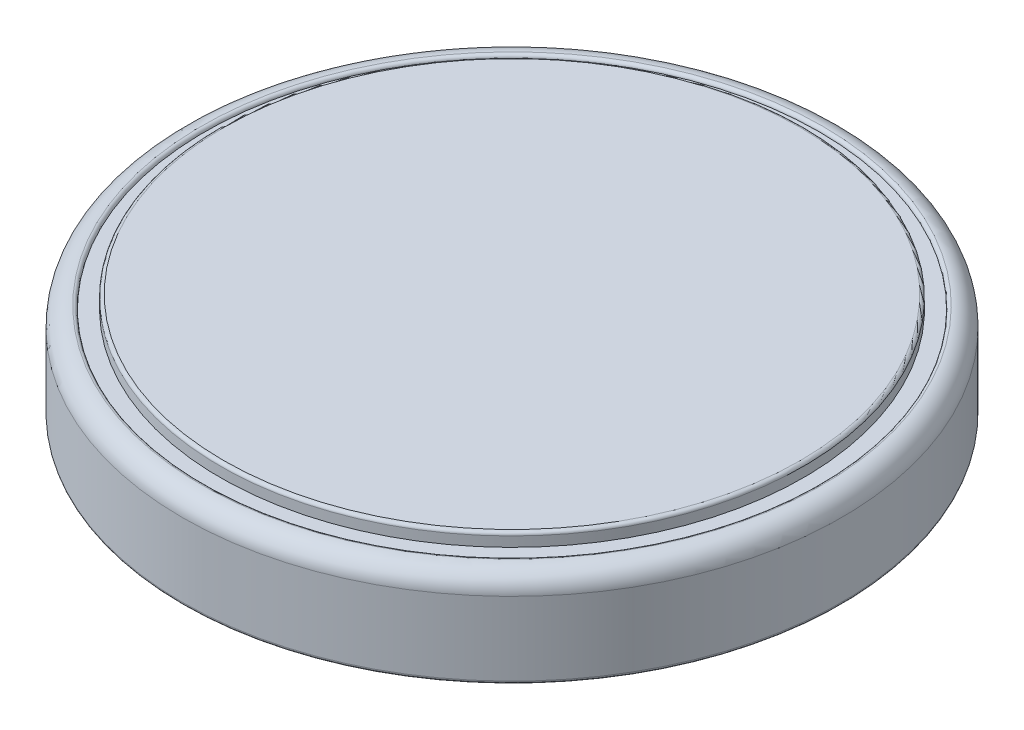
ISO-10303-21;
HEADER;
FILE_DESCRIPTION(('STEP AP214'),'2;1');
FILE_NAME('part.step','',(''),(''),'','','');
FILE_SCHEMA(('AUTOMOTIVE_DESIGN { 1 0 10303 214 1 1 1 1 }'));
ENDSEC;
DATA;
#1=APPLICATION_CONTEXT('core data for automotive mechanical design processes');
#2=APPLICATION_PROTOCOL_DEFINITION('international standard','automotive_design',2000,#1);
#3=PRODUCT_CONTEXT('',#1,'mechanical');
#4=PRODUCT('Part','Part','',(#3));
#5=PRODUCT_RELATED_PRODUCT_CATEGORY('part','',(#4));
#6=PRODUCT_DEFINITION_FORMATION('','',#4);
#7=PRODUCT_DEFINITION_CONTEXT('part definition',#1,'design');
#8=PRODUCT_DEFINITION('design','',#6,#7);
#9=PRODUCT_DEFINITION_SHAPE('','',#8);
#10=(LENGTH_UNIT() NAMED_UNIT(*) SI_UNIT(.MILLI.,.METRE.));
#11=(NAMED_UNIT(*) PLANE_ANGLE_UNIT() SI_UNIT($,.RADIAN.));
#12=(NAMED_UNIT(*) SI_UNIT($,.STERADIAN.) SOLID_ANGLE_UNIT());
#13=UNCERTAINTY_MEASURE_WITH_UNIT(LENGTH_MEASURE(1.E-05),#10,'distance_accuracy_value','');
#14=(GEOMETRIC_REPRESENTATION_CONTEXT(3) GLOBAL_UNCERTAINTY_ASSIGNED_CONTEXT((#13)) GLOBAL_UNIT_ASSIGNED_CONTEXT((#10,
#11,#12)) REPRESENTATION_CONTEXT('',''));
#15=CARTESIAN_POINT('',(0.,0.,0.));
#16=DIRECTION('',(0.,0.,1.));
#17=DIRECTION('',(1.,0.,0.));
#18=AXIS2_PLACEMENT_3D('',#15,#16,#17);
#19=CARTESIAN_POINT('',(0.,3.2,0.));
#20=DIRECTION('',(0.,1.,0.));
#21=DIRECTION('',(0.,0.,1.));
#22=AXIS2_PLACEMENT_3D('',#19,#20,#21);
#23=PLANE('',#22);
#24=CARTESIAN_POINT('',(0.,3.2,0.));
#25=DIRECTION('',(0.,-1.,0.));
#26=DIRECTION('',(0.,0.,-1.));
#27=AXIS2_PLACEMENT_3D('',#24,#25,#26);
#28=CIRCLE('',#27,8.75);
#29=CARTESIAN_POINT('',(0.,3.2,-8.75));
#30=VERTEX_POINT('',#29);
#31=EDGE_CURVE('E45',#30,#30,#28,.T.);
#32=ORIENTED_EDGE('',*,*,#31,.F.);
#33=EDGE_LOOP('',(#32));
#34=FACE_BOUND('',#33,.T.);
#35=ADVANCED_FACE('F34',(#34),#23,.T.);
#36=CARTESIAN_POINT('',(0.,3.1,0.));
#37=DIRECTION('',(0.,-1.,0.));
#38=DIRECTION('',(0.,0.,-1.));
#39=AXIS2_PLACEMENT_3D('',#36,#37,#38);
#40=TOROIDAL_SURFACE('',#39,8.75,0.0999999999999996);
#41=ORIENTED_EDGE('',*,*,#31,.T.);
#42=EDGE_LOOP('',(#41));
#43=FACE_BOUND('',#42,.T.);
#44=CARTESIAN_POINT('',(0.,3.1,0.));
#45=DIRECTION('',(0.,-1.,0.));
#46=DIRECTION('',(0.,0.,-1.));
#47=AXIS2_PLACEMENT_3D('',#44,#45,#46);
#48=CIRCLE('',#47,8.85);
#49=CARTESIAN_POINT('',(0.,3.1,-8.85));
#50=VERTEX_POINT('',#49);
#51=EDGE_CURVE('E49',#50,#50,#48,.T.);
#52=ORIENTED_EDGE('',*,*,#51,.F.);
#53=EDGE_LOOP('',(#52));
#54=FACE_BOUND('',#53,.T.);
#55=ADVANCED_FACE('F84',(#43,#54),#40,.T.);
#56=CARTESIAN_POINT('',(0.,0.,0.));
#57=DIRECTION('',(0.,-1.,0.));
#58=DIRECTION('',(0.,0.,-1.));
#59=AXIS2_PLACEMENT_3D('',#56,#57,#58);
#60=CYLINDRICAL_SURFACE('',#59,8.85);
#61=ORIENTED_EDGE('',*,*,#51,.T.);
#62=EDGE_LOOP('',(#61));
#63=FACE_BOUND('',#62,.T.);
#64=CARTESIAN_POINT('',(0.,2.8,0.));
#65=DIRECTION('',(0.,-1.,0.));
#66=DIRECTION('',(0.,0.,-1.));
#67=AXIS2_PLACEMENT_3D('',#64,#65,#66);
#68=CIRCLE('',#67,8.85);
#69=CARTESIAN_POINT('',(0.,2.8,-8.85));
#70=VERTEX_POINT('',#69);
#71=EDGE_CURVE('E54',#70,#70,#68,.T.);
#72=ORIENTED_EDGE('',*,*,#71,.F.);
#73=EDGE_LOOP('',(#72));
#74=FACE_BOUND('',#73,.T.);
#75=ADVANCED_FACE('F89',(#63,#74),#60,.T.);
#76=CARTESIAN_POINT('',(8.85,2.8,0.));
#77=DIRECTION('',(0.,1.,0.));
#78=DIRECTION('',(0.,0.,1.));
#79=AXIS2_PLACEMENT_3D('',#76,#77,#78);
#80=PLANE('',#79);
#81=ORIENTED_EDGE('',*,*,#71,.T.);
#82=EDGE_LOOP('',(#81));
#83=FACE_BOUND('',#82,.T.);
#84=CARTESIAN_POINT('',(0.,2.8,0.));
#85=DIRECTION('',(0.,-1.,0.));
#86=DIRECTION('',(0.,0.,-1.));
#87=AXIS2_PLACEMENT_3D('',#84,#85,#86);
#88=CIRCLE('',#87,9.325);
#89=CARTESIAN_POINT('',(0.,2.8,-9.325));
#90=VERTEX_POINT('',#89);
#91=EDGE_CURVE('E57',#90,#90,#88,.T.);
#92=ORIENTED_EDGE('',*,*,#91,.F.);
#93=EDGE_LOOP('',(#92));
#94=FACE_BOUND('',#93,.T.);
#95=ADVANCED_FACE('F80',(#83,#94),#80,.T.);
#96=CARTESIAN_POINT('',(0.,2.8,0.));
#97=DIRECTION('',(0.,-1.,0.));
#98=DIRECTION('',(0.,0.,-1.));
#99=AXIS2_PLACEMENT_3D('',#96,#97,#98);
#100=TOROIDAL_SURFACE('',#99,9.425,0.0999999999999996);
#101=ORIENTED_EDGE('',*,*,#91,.T.);
#102=EDGE_LOOP('',(#101));
#103=FACE_BOUND('',#102,.T.);
#104=CARTESIAN_POINT('',(0.,2.9,0.));
#105=DIRECTION('',(0.,-1.,0.));
#106=DIRECTION('',(0.,0.,-1.));
#107=AXIS2_PLACEMENT_3D('',#104,#105,#106);
#108=CIRCLE('',#107,9.425);
#109=CARTESIAN_POINT('',(0.,2.9,-9.425));
#110=VERTEX_POINT('',#109);
#111=EDGE_CURVE('E60',#110,#110,#108,.T.);
#112=ORIENTED_EDGE('',*,*,#111,.F.);
#113=EDGE_LOOP('',(#112));
#114=FACE_BOUND('',#113,.T.);
#115=ADVANCED_FACE('F71',(#103,#114),#100,.T.);
#116=CARTESIAN_POINT('',(0.,2.325,0.));
#117=DIRECTION('',(0.,-1.,0.));
#118=DIRECTION('',(0.,0.,-1.));
#119=AXIS2_PLACEMENT_3D('',#116,#117,#118);
#120=TOROIDAL_SURFACE('',#119,9.425,0.575000000000001);
#121=ORIENTED_EDGE('',*,*,#111,.T.);
#122=EDGE_LOOP('',(#121));
#123=FACE_BOUND('',#122,.T.);
#124=CARTESIAN_POINT('',(0.,2.325,0.));
#125=DIRECTION('',(0.,-1.,0.));
#126=DIRECTION('',(0.,0.,-1.));
#127=AXIS2_PLACEMENT_3D('',#124,#125,#126);
#128=CIRCLE('',#127,10.);
#129=CARTESIAN_POINT('',(0.,2.325,-10.));
#130=VERTEX_POINT('',#129);
#131=EDGE_CURVE('E63',#130,#130,#128,.T.);
#132=ORIENTED_EDGE('',*,*,#131,.F.);
#133=EDGE_LOOP('',(#132));
#134=FACE_BOUND('',#133,.T.);
#135=ADVANCED_FACE('F69',(#123,#134),#120,.T.);
#136=CARTESIAN_POINT('',(0.,0.,0.));
#137=DIRECTION('',(0.,-1.,0.));
#138=DIRECTION('',(0.,0.,-1.));
#139=AXIS2_PLACEMENT_3D('',#136,#137,#138);
#140=CYLINDRICAL_SURFACE('',#139,10.);
#141=CARTESIAN_POINT('',(0.,0.1,0.));
#142=DIRECTION('',(0.,-1.,0.));
#143=DIRECTION('',(0.,0.,-1.));
#144=AXIS2_PLACEMENT_3D('',#141,#142,#143);
#145=CIRCLE('',#144,10.);
#146=CARTESIAN_POINT('',(0.,0.1,-10.));
#147=VERTEX_POINT('',#146);
#148=EDGE_CURVE('E10',#147,#147,#145,.F.);
#149=ORIENTED_EDGE('',*,*,#148,.T.);
#150=EDGE_LOOP('',(#149));
#151=FACE_BOUND('',#150,.T.);
#152=ORIENTED_EDGE('',*,*,#131,.T.);
#153=EDGE_LOOP('',(#152));
#154=FACE_BOUND('',#153,.T.);
#155=ADVANCED_FACE('F67',(#151,#154),#140,.T.);
#156=CARTESIAN_POINT('',(0.,0.,0.));
#157=DIRECTION('',(0.,-1.,0.));
#158=DIRECTION('',(0.,0.,-1.));
#159=AXIS2_PLACEMENT_3D('',#156,#157,#158);
#160=PLANE('',#159);
#161=CARTESIAN_POINT('',(0.,0.,0.));
#162=DIRECTION('',(0.,-1.,0.));
#163=DIRECTION('',(0.,0.,-1.));
#164=AXIS2_PLACEMENT_3D('',#161,#162,#163);
#165=CIRCLE('',#164,9.9);
#166=CARTESIAN_POINT('',(0.,0.,-9.9));
#167=VERTEX_POINT('',#166);
#168=EDGE_CURVE('E41',#167,#167,#165,.T.);
#169=ORIENTED_EDGE('',*,*,#168,.T.);
#170=EDGE_LOOP('',(#169));
#171=FACE_BOUND('',#170,.T.);
#172=ADVANCED_FACE('F78',(#171),#160,.T.);
#173=CARTESIAN_POINT('',(0.,0.1,0.));
#174=DIRECTION('',(0.,-1.,0.));
#175=DIRECTION('',(0.,0.,-1.));
#176=AXIS2_PLACEMENT_3D('',#173,#174,#175);
#177=TOROIDAL_SURFACE('',#176,9.9,0.1);
#178=ORIENTED_EDGE('',*,*,#148,.F.);
#179=EDGE_LOOP('',(#178));
#180=FACE_BOUND('',#179,.T.);
#181=ORIENTED_EDGE('',*,*,#168,.F.);
#182=EDGE_LOOP('',(#181));
#183=FACE_BOUND('',#182,.T.);
#184=ADVANCED_FACE('F36',(#180,#183),#177,.T.);
#185=CLOSED_SHELL('',(#35,#55,#75,#95,#115,#135,#155,#172,#184));
#186=MANIFOLD_SOLID_BREP('B2',#185);
#187=ADVANCED_BREP_SHAPE_REPRESENTATION('',(#18,#186),#14);
#188=SHAPE_DEFINITION_REPRESENTATION(#9,#187);
ENDSEC;
END-ISO-10303-21;
